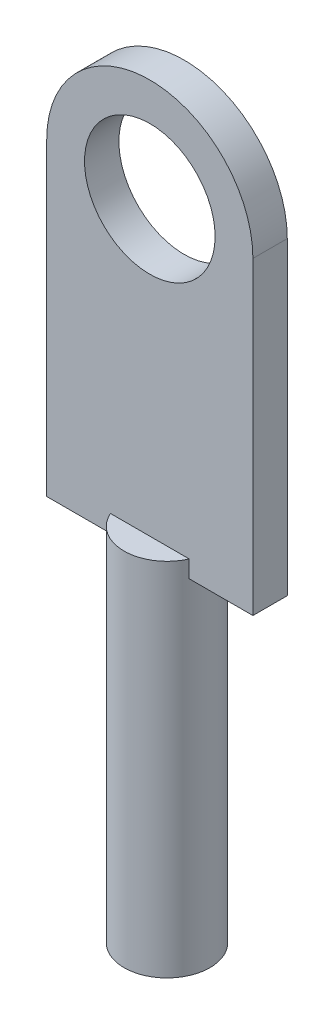
ISO-10303-21;
HEADER;
FILE_DESCRIPTION(('STEP AP214'),'2;1');
FILE_NAME('part.step','',(''),(''),'','','');
FILE_SCHEMA(('AUTOMOTIVE_DESIGN { 1 0 10303 214 1 1 1 1 }'));
ENDSEC;
DATA;
#1=APPLICATION_CONTEXT('core data for automotive mechanical design processes');
#2=APPLICATION_PROTOCOL_DEFINITION('international standard','automotive_design',2000,#1);
#3=PRODUCT_CONTEXT('',#1,'mechanical');
#4=PRODUCT('Part','Part','',(#3));
#5=PRODUCT_RELATED_PRODUCT_CATEGORY('part','',(#4));
#6=PRODUCT_DEFINITION_FORMATION('','',#4);
#7=PRODUCT_DEFINITION_CONTEXT('part definition',#1,'design');
#8=PRODUCT_DEFINITION('design','',#6,#7);
#9=PRODUCT_DEFINITION_SHAPE('','',#8);
#10=(LENGTH_UNIT() NAMED_UNIT(*) SI_UNIT(.MILLI.,.METRE.));
#11=(NAMED_UNIT(*) PLANE_ANGLE_UNIT() SI_UNIT($,.RADIAN.));
#12=(NAMED_UNIT(*) SI_UNIT($,.STERADIAN.) SOLID_ANGLE_UNIT());
#13=UNCERTAINTY_MEASURE_WITH_UNIT(LENGTH_MEASURE(1.E-05),#10,'distance_accuracy_value','');
#14=(GEOMETRIC_REPRESENTATION_CONTEXT(3) GLOBAL_UNCERTAINTY_ASSIGNED_CONTEXT((#13)) GLOBAL_UNIT_ASSIGNED_CONTEXT((#10,
#11,#12)) REPRESENTATION_CONTEXT('',''));
#15=CARTESIAN_POINT('',(0.,0.,0.));
#16=DIRECTION('',(0.,0.,1.));
#17=DIRECTION('',(1.,0.,0.));
#18=AXIS2_PLACEMENT_3D('',#15,#16,#17);
#19=CARTESIAN_POINT('',(0.,8.255,0.));
#20=DIRECTION('',(0.,1.,0.));
#21=DIRECTION('',(0.,0.,1.));
#22=AXIS2_PLACEMENT_3D('',#19,#20,#21);
#23=PLANE('',#22);
#24=CARTESIAN_POINT('',(0.,8.255,0.));
#25=DIRECTION('',(0.,1.,0.));
#26=DIRECTION('',(0.,0.,1.));
#27=AXIS2_PLACEMENT_3D('',#24,#25,#26);
#28=CIRCLE('',#27,1.5875);
#29=CARTESIAN_POINT('',(1.45496778314848,8.255,-0.635));
#30=VERTEX_POINT('',#29);
#31=CARTESIAN_POINT('',(-1.45496778314848,8.255,-0.635));
#32=VERTEX_POINT('',#31);
#33=EDGE_CURVE('E157',#30,#32,#28,.T.);
#34=ORIENTED_EDGE('',*,*,#33,.T.);
#35=DIRECTION('',(1.,0.,0.));
#36=VECTOR('',#35,1.);
#37=CARTESIAN_POINT('',(0.,8.255,-0.635));
#38=LINE('',#37,#36);
#39=EDGE_CURVE('E158',#32,#30,#38,.T.);
#40=ORIENTED_EDGE('',*,*,#39,.T.);
#41=EDGE_LOOP('',(#34,#40));
#42=FACE_BOUND('',#41,.T.);
#43=ADVANCED_FACE('F32',(#42),#23,.T.);
#44=CARTESIAN_POINT('',(0.,8.255,0.));
#45=DIRECTION('',(0.,-1.,0.));
#46=DIRECTION('',(0.,0.,-1.));
#47=AXIS2_PLACEMENT_3D('',#44,#45,#46);
#48=CYLINDRICAL_SURFACE('',#47,1.5875);
#49=CARTESIAN_POINT('',(0.,7.62,0.));
#50=DIRECTION('',(0.,1.,0.));
#51=DIRECTION('',(0.,0.,1.));
#52=AXIS2_PLACEMENT_3D('',#49,#50,#51);
#53=CIRCLE('',#52,1.5875);
#54=CARTESIAN_POINT('',(1.45496778314848,7.62,0.635));
#55=VERTEX_POINT('',#54);
#56=CARTESIAN_POINT('',(1.45496778314848,7.62,-0.635));
#57=VERTEX_POINT('',#56);
#58=EDGE_CURVE('E11',#55,#57,#53,.T.);
#59=ORIENTED_EDGE('',*,*,#58,.F.);
#60=DIRECTION('',(0.,-1.,0.));
#61=VECTOR('',#60,1.);
#62=CARTESIAN_POINT('',(1.45496778314848,8.255,0.635));
#63=LINE('',#62,#61);
#64=CARTESIAN_POINT('',(1.45496778314848,8.255,0.635));
#65=VERTEX_POINT('',#64);
#66=EDGE_CURVE('E149',#55,#65,#63,.F.);
#67=ORIENTED_EDGE('',*,*,#66,.T.);
#68=CARTESIAN_POINT('',(-1.45496778314848,8.255,0.635));
#69=VERTEX_POINT('',#68);
#70=EDGE_CURVE('E154',#69,#65,#28,.T.);
#71=ORIENTED_EDGE('',*,*,#70,.F.);
#72=DIRECTION('',(0.,-1.,0.));
#73=VECTOR('',#72,1.);
#74=CARTESIAN_POINT('',(-1.45496778314848,8.255,0.635));
#75=LINE('',#74,#73);
#76=CARTESIAN_POINT('',(-1.45496778314848,7.62,0.635));
#77=VERTEX_POINT('',#76);
#78=EDGE_CURVE('E151',#69,#77,#75,.T.);
#79=ORIENTED_EDGE('',*,*,#78,.T.);
#80=CARTESIAN_POINT('',(-1.45496778314848,7.62,-0.635));
#81=VERTEX_POINT('',#80);
#82=EDGE_CURVE('E36',#81,#77,#53,.T.);
#83=ORIENTED_EDGE('',*,*,#82,.F.);
#84=DIRECTION('',(0.,-1.,0.));
#85=VECTOR('',#84,1.);
#86=CARTESIAN_POINT('',(-1.45496778314848,8.255,-0.635));
#87=LINE('',#86,#85);
#88=EDGE_CURVE('E147',#32,#81,#87,.T.);
#89=ORIENTED_EDGE('',*,*,#88,.F.);
#90=ORIENTED_EDGE('',*,*,#33,.F.);
#91=DIRECTION('',(0.,-1.,0.));
#92=VECTOR('',#91,1.);
#93=CARTESIAN_POINT('',(1.45496778314848,8.255,-0.635));
#94=LINE('',#93,#92);
#95=EDGE_CURVE('E47',#57,#30,#94,.F.);
#96=ORIENTED_EDGE('',*,*,#95,.F.);
#97=EDGE_LOOP('',(#59,#67,#71,#79,#83,#89,#90,#96));
#98=FACE_BOUND('',#97,.T.);
#99=CARTESIAN_POINT('',(0.,-5.08,0.));
#100=DIRECTION('',(0.,-1.,0.));
#101=DIRECTION('',(0.,0.,-1.));
#102=AXIS2_PLACEMENT_3D('',#99,#100,#101);
#103=CIRCLE('',#102,1.5875);
#104=CARTESIAN_POINT('',(0.,-5.08,-1.5875));
#105=VERTEX_POINT('',#104);
#106=EDGE_CURVE('E221',#105,#105,#103,.T.);
#107=ORIENTED_EDGE('',*,*,#106,.F.);
#108=EDGE_LOOP('',(#107));
#109=FACE_BOUND('',#108,.T.);
#110=ADVANCED_FACE('F34',(#98,#109),#48,.T.);
#111=DIRECTION('',(1.,0.,0.));
#112=VECTOR('',#111,1.);
#113=CARTESIAN_POINT('',(0.,8.255,0.635));
#114=LINE('',#113,#112);
#115=EDGE_CURVE('E55',#69,#65,#114,.T.);
#116=ORIENTED_EDGE('',*,*,#115,.F.);
#117=ORIENTED_EDGE('',*,*,#70,.T.);
#118=EDGE_LOOP('',(#116,#117));
#119=FACE_BOUND('',#118,.T.);
#120=ADVANCED_FACE('F170',(#119),#23,.T.);
#121=CARTESIAN_POINT('',(-3.81,7.62,0.635));
#122=DIRECTION('',(0.,1.,0.));
#123=DIRECTION('',(0.,0.,1.));
#124=AXIS2_PLACEMENT_3D('',#121,#122,#123);
#125=PLANE('',#124);
#126=DIRECTION('',(1.,0.,0.));
#127=VECTOR('',#126,1.);
#128=CARTESIAN_POINT('',(-3.81,7.62,0.635));
#129=LINE('',#128,#127);
#130=CARTESIAN_POINT('',(3.81,7.62,0.635));
#131=VERTEX_POINT('',#130);
#132=EDGE_CURVE('E135',#55,#131,#129,.T.);
#133=ORIENTED_EDGE('',*,*,#132,.F.);
#134=ORIENTED_EDGE('',*,*,#58,.T.);
#135=DIRECTION('',(1.,0.,0.));
#136=VECTOR('',#135,1.);
#137=CARTESIAN_POINT('',(-3.81,7.62,-0.635));
#138=LINE('',#137,#136);
#139=CARTESIAN_POINT('',(3.81,7.62,-0.635));
#140=VERTEX_POINT('',#139);
#141=EDGE_CURVE('E107',#57,#140,#138,.T.);
#142=ORIENTED_EDGE('',*,*,#141,.T.);
#143=DIRECTION('',(0.,0.,-1.));
#144=VECTOR('',#143,1.);
#145=CARTESIAN_POINT('',(3.81,7.62,0.635));
#146=LINE('',#145,#144);
#147=EDGE_CURVE('E142',#131,#140,#146,.T.);
#148=ORIENTED_EDGE('',*,*,#147,.F.);
#149=EDGE_LOOP('',(#133,#134,#142,#148));
#150=FACE_BOUND('',#149,.T.);
#151=ADVANCED_FACE('F172',(#150),#125,.F.);
#152=CARTESIAN_POINT('',(-3.81,7.62,-0.635));
#153=VERTEX_POINT('',#152);
#154=EDGE_CURVE('E103',#153,#81,#138,.T.);
#155=ORIENTED_EDGE('',*,*,#154,.T.);
#156=ORIENTED_EDGE('',*,*,#82,.T.);
#157=CARTESIAN_POINT('',(-3.81,7.62,0.635));
#158=VERTEX_POINT('',#157);
#159=EDGE_CURVE('E136',#158,#77,#129,.T.);
#160=ORIENTED_EDGE('',*,*,#159,.F.);
#161=DIRECTION('',(0.,0.,-1.));
#162=VECTOR('',#161,1.);
#163=CARTESIAN_POINT('',(-3.81,7.62,0.635));
#164=LINE('',#163,#162);
#165=EDGE_CURVE('E116',#158,#153,#164,.T.);
#166=ORIENTED_EDGE('',*,*,#165,.T.);
#167=EDGE_LOOP('',(#155,#156,#160,#166));
#168=FACE_BOUND('',#167,.T.);
#169=ADVANCED_FACE('F162',(#168),#125,.F.);
#170=CARTESIAN_POINT('',(0.,19.05,0.635));
#171=DIRECTION('',(0.,0.,1.));
#172=DIRECTION('',(1.,0.,0.));
#173=AXIS2_PLACEMENT_3D('',#170,#171,#172);
#174=PLANE('',#173);
#175=CARTESIAN_POINT('',(0.,19.05,0.635));
#176=DIRECTION('',(0.,0.,1.));
#177=DIRECTION('',(1.,0.,0.));
#178=AXIS2_PLACEMENT_3D('',#175,#176,#177);
#179=CIRCLE('',#178,2.413);
#180=CARTESIAN_POINT('',(2.413,19.05,0.635));
#181=VERTEX_POINT('',#180);
#182=EDGE_CURVE('E122',#181,#181,#179,.T.);
#183=ORIENTED_EDGE('',*,*,#182,.F.);
#184=EDGE_LOOP('',(#183));
#185=FACE_BOUND('',#184,.T.);
#186=ORIENTED_EDGE('',*,*,#78,.F.);
#187=ORIENTED_EDGE('',*,*,#115,.T.);
#188=ORIENTED_EDGE('',*,*,#66,.F.);
#189=ORIENTED_EDGE('',*,*,#132,.T.);
#190=DIRECTION('',(0.,1.,0.));
#191=VECTOR('',#190,1.);
#192=CARTESIAN_POINT('',(3.81,19.05,0.635));
#193=LINE('',#192,#191);
#194=CARTESIAN_POINT('',(3.81,19.05,0.635));
#195=VERTEX_POINT('',#194);
#196=EDGE_CURVE('E139',#131,#195,#193,.T.);
#197=ORIENTED_EDGE('',*,*,#196,.T.);
#198=CARTESIAN_POINT('',(0.,19.05,0.635));
#199=DIRECTION('',(0.,0.,1.));
#200=DIRECTION('',(1.,0.,0.));
#201=AXIS2_PLACEMENT_3D('',#198,#199,#200);
#202=CIRCLE('',#201,3.81);
#203=CARTESIAN_POINT('',(-3.81,19.05,0.635));
#204=VERTEX_POINT('',#203);
#205=EDGE_CURVE('E132',#195,#204,#202,.T.);
#206=ORIENTED_EDGE('',*,*,#205,.T.);
#207=DIRECTION('',(0.,-1.,0.));
#208=VECTOR('',#207,1.);
#209=CARTESIAN_POINT('',(-3.81,19.05,0.635));
#210=LINE('',#209,#208);
#211=EDGE_CURVE('E112',#204,#158,#210,.T.);
#212=ORIENTED_EDGE('',*,*,#211,.T.);
#213=ORIENTED_EDGE('',*,*,#159,.T.);
#214=EDGE_LOOP('',(#186,#187,#188,#189,#197,#206,#212,#213));
#215=FACE_BOUND('',#214,.T.);
#216=ADVANCED_FACE('F165',(#185,#215),#174,.T.);
#217=CARTESIAN_POINT('',(0.,19.05,-0.635));
#218=DIRECTION('',(0.,0.,1.));
#219=DIRECTION('',(1.,0.,0.));
#220=AXIS2_PLACEMENT_3D('',#217,#218,#219);
#221=PLANE('',#220);
#222=CARTESIAN_POINT('',(0.,19.05,-0.635));
#223=DIRECTION('',(0.,0.,1.));
#224=DIRECTION('',(1.,0.,0.));
#225=AXIS2_PLACEMENT_3D('',#222,#223,#224);
#226=CIRCLE('',#225,2.413);
#227=CARTESIAN_POINT('',(2.413,19.05,-0.635));
#228=VERTEX_POINT('',#227);
#229=EDGE_CURVE('E125',#228,#228,#226,.T.);
#230=ORIENTED_EDGE('',*,*,#229,.T.);
#231=EDGE_LOOP('',(#230));
#232=FACE_BOUND('',#231,.T.);
#233=ORIENTED_EDGE('',*,*,#39,.F.);
#234=ORIENTED_EDGE('',*,*,#88,.T.);
#235=ORIENTED_EDGE('',*,*,#154,.F.);
#236=DIRECTION('',(0.,-1.,0.));
#237=VECTOR('',#236,1.);
#238=CARTESIAN_POINT('',(-3.81,19.05,-0.635));
#239=LINE('',#238,#237);
#240=CARTESIAN_POINT('',(-3.81,19.05,-0.635));
#241=VERTEX_POINT('',#240);
#242=EDGE_CURVE('E96',#241,#153,#239,.T.);
#243=ORIENTED_EDGE('',*,*,#242,.F.);
#244=CARTESIAN_POINT('',(0.,19.05,-0.635));
#245=DIRECTION('',(0.,0.,1.));
#246=DIRECTION('',(1.,0.,0.));
#247=AXIS2_PLACEMENT_3D('',#244,#245,#246);
#248=CIRCLE('',#247,3.81);
#249=CARTESIAN_POINT('',(3.81,19.05,-0.635));
#250=VERTEX_POINT('',#249);
#251=EDGE_CURVE('E101',#250,#241,#248,.T.);
#252=ORIENTED_EDGE('',*,*,#251,.F.);
#253=DIRECTION('',(0.,1.,0.));
#254=VECTOR('',#253,1.);
#255=CARTESIAN_POINT('',(3.81,19.05,-0.635));
#256=LINE('',#255,#254);
#257=EDGE_CURVE('E130',#140,#250,#256,.T.);
#258=ORIENTED_EDGE('',*,*,#257,.F.);
#259=ORIENTED_EDGE('',*,*,#141,.F.);
#260=ORIENTED_EDGE('',*,*,#95,.T.);
#261=EDGE_LOOP('',(#233,#234,#235,#243,#252,#258,#259,#260));
#262=FACE_BOUND('',#261,.T.);
#263=ADVANCED_FACE('F98',(#232,#262),#221,.F.);
#264=CARTESIAN_POINT('',(0.,19.05,0.635));
#265=DIRECTION('',(0.,0.,-1.));
#266=DIRECTION('',(-1.,0.,0.));
#267=AXIS2_PLACEMENT_3D('',#264,#265,#266);
#268=CYLINDRICAL_SURFACE('',#267,3.81);
#269=ORIENTED_EDGE('',*,*,#251,.T.);
#270=DIRECTION('',(0.,0.,-1.));
#271=VECTOR('',#270,1.);
#272=CARTESIAN_POINT('',(-3.81,19.05,0.635));
#273=LINE('',#272,#271);
#274=EDGE_CURVE('E110',#204,#241,#273,.T.);
#275=ORIENTED_EDGE('',*,*,#274,.F.);
#276=ORIENTED_EDGE('',*,*,#205,.F.);
#277=DIRECTION('',(0.,0.,-1.));
#278=VECTOR('',#277,1.);
#279=CARTESIAN_POINT('',(3.81,19.05,0.635));
#280=LINE('',#279,#278);
#281=EDGE_CURVE('E121',#195,#250,#280,.T.);
#282=ORIENTED_EDGE('',*,*,#281,.T.);
#283=EDGE_LOOP('',(#269,#275,#276,#282));
#284=FACE_BOUND('',#283,.T.);
#285=ADVANCED_FACE('F119',(#284),#268,.T.);
#286=CARTESIAN_POINT('',(-3.81,19.05,0.635));
#287=DIRECTION('',(1.,0.,0.));
#288=DIRECTION('',(0.,1.,0.));
#289=AXIS2_PLACEMENT_3D('',#286,#287,#288);
#290=PLANE('',#289);
#291=ORIENTED_EDGE('',*,*,#242,.T.);
#292=ORIENTED_EDGE('',*,*,#165,.F.);
#293=ORIENTED_EDGE('',*,*,#211,.F.);
#294=ORIENTED_EDGE('',*,*,#274,.T.);
#295=EDGE_LOOP('',(#291,#292,#293,#294));
#296=FACE_BOUND('',#295,.T.);
#297=ADVANCED_FACE('F111',(#296),#290,.F.);
#298=CARTESIAN_POINT('',(3.81,19.05,0.635));
#299=DIRECTION('',(-1.,0.,0.));
#300=DIRECTION('',(0.,-1.,0.));
#301=AXIS2_PLACEMENT_3D('',#298,#299,#300);
#302=PLANE('',#301);
#303=ORIENTED_EDGE('',*,*,#257,.T.);
#304=ORIENTED_EDGE('',*,*,#281,.F.);
#305=ORIENTED_EDGE('',*,*,#196,.F.);
#306=ORIENTED_EDGE('',*,*,#147,.T.);
#307=EDGE_LOOP('',(#303,#304,#305,#306));
#308=FACE_BOUND('',#307,.T.);
#309=ADVANCED_FACE('F189',(#308),#302,.F.);
#310=CARTESIAN_POINT('',(0.,19.05,0.635));
#311=DIRECTION('',(0.,0.,-1.));
#312=DIRECTION('',(-1.,0.,0.));
#313=AXIS2_PLACEMENT_3D('',#310,#311,#312);
#314=CYLINDRICAL_SURFACE('',#313,2.413);
#315=ORIENTED_EDGE('',*,*,#182,.T.);
#316=EDGE_LOOP('',(#315));
#317=FACE_BOUND('',#316,.T.);
#318=ORIENTED_EDGE('',*,*,#229,.F.);
#319=EDGE_LOOP('',(#318));
#320=FACE_BOUND('',#319,.T.);
#321=ADVANCED_FACE('F192',(#317,#320),#314,.F.);
#322=CARTESIAN_POINT('',(0.,-5.08,0.));
#323=DIRECTION('',(0.,-1.,0.));
#324=DIRECTION('',(0.,0.,-1.));
#325=AXIS2_PLACEMENT_3D('',#322,#323,#324);
#326=PLANE('',#325);
#327=ORIENTED_EDGE('',*,*,#106,.T.);
#328=EDGE_LOOP('',(#327));
#329=FACE_BOUND('',#328,.T.);
#330=ADVANCED_FACE('F198',(#329),#326,.T.);
#331=CLOSED_SHELL('',(#43,#110,#120,#151,#169,#216,#263,#285,#297,#309,#321,#330));
#332=MANIFOLD_SOLID_BREP('B2',#331);
#333=ADVANCED_BREP_SHAPE_REPRESENTATION('',(#18,#332),#14);
#334=SHAPE_DEFINITION_REPRESENTATION(#9,#333);
ENDSEC;
END-ISO-10303-21;
